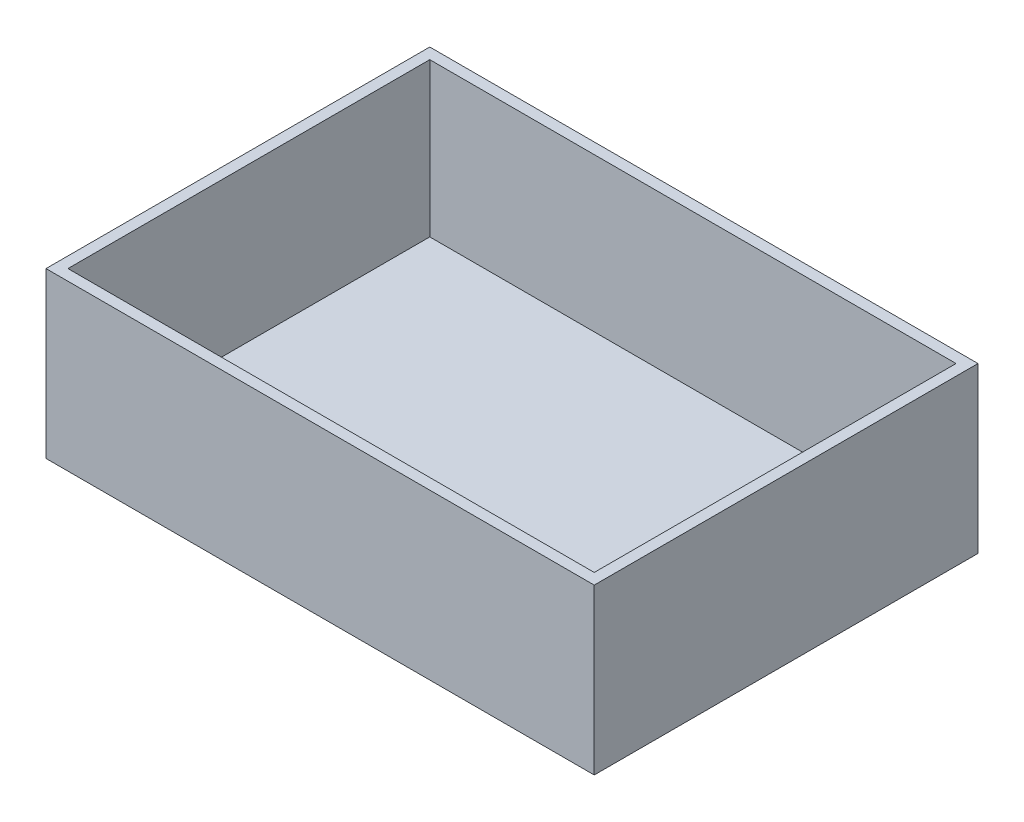
ISO-10303-21;
HEADER;
FILE_DESCRIPTION(('STEP AP214'),'2;1');
FILE_NAME('part.step','',(''),(''),'','','');
FILE_SCHEMA(('AUTOMOTIVE_DESIGN { 1 0 10303 214 1 1 1 1 }'));
ENDSEC;
DATA;
#1=APPLICATION_CONTEXT('core data for automotive mechanical design processes');
#2=APPLICATION_PROTOCOL_DEFINITION('international standard','automotive_design',2000,#1);
#3=PRODUCT_CONTEXT('',#1,'mechanical');
#4=PRODUCT('Part','Part','',(#3));
#5=PRODUCT_RELATED_PRODUCT_CATEGORY('part','',(#4));
#6=PRODUCT_DEFINITION_FORMATION('','',#4);
#7=PRODUCT_DEFINITION_CONTEXT('part definition',#1,'design');
#8=PRODUCT_DEFINITION('design','',#6,#7);
#9=PRODUCT_DEFINITION_SHAPE('','',#8);
#10=(LENGTH_UNIT() NAMED_UNIT(*) SI_UNIT(.MILLI.,.METRE.));
#11=(NAMED_UNIT(*) PLANE_ANGLE_UNIT() SI_UNIT($,.RADIAN.));
#12=(NAMED_UNIT(*) SI_UNIT($,.STERADIAN.) SOLID_ANGLE_UNIT());
#13=UNCERTAINTY_MEASURE_WITH_UNIT(LENGTH_MEASURE(1.E-05),#10,'distance_accuracy_value','');
#14=(GEOMETRIC_REPRESENTATION_CONTEXT(3) GLOBAL_UNCERTAINTY_ASSIGNED_CONTEXT((#13)) GLOBAL_UNIT_ASSIGNED_CONTEXT((#10,
#11,#12)) REPRESENTATION_CONTEXT('',''));
#15=CARTESIAN_POINT('',(0.,0.,0.));
#16=DIRECTION('',(0.,0.,1.));
#17=DIRECTION('',(1.,0.,0.));
#18=AXIS2_PLACEMENT_3D('',#15,#16,#17);
#19=CARTESIAN_POINT('',(-50.,30.,35.));
#20=DIRECTION('',(1.,0.,0.));
#21=DIRECTION('',(0.,0.,-1.));
#22=AXIS2_PLACEMENT_3D('',#19,#20,#21);
#23=PLANE('',#22);
#24=DIRECTION('',(0.,0.,1.));
#25=VECTOR('',#24,1.);
#26=CARTESIAN_POINT('',(-50.,0.,35.));
#27=LINE('',#26,#25);
#28=CARTESIAN_POINT('',(-50.,0.,-35.));
#29=VERTEX_POINT('',#28);
#30=CARTESIAN_POINT('',(-50.,0.,35.));
#31=VERTEX_POINT('',#30);
#32=EDGE_CURVE('E175',#29,#31,#27,.T.);
#33=ORIENTED_EDGE('',*,*,#32,.T.);
#34=DIRECTION('',(0.,-1.,0.));
#35=VECTOR('',#34,1.);
#36=CARTESIAN_POINT('',(-50.,30.,35.));
#37=LINE('',#36,#35);
#38=CARTESIAN_POINT('',(-50.,30.,35.));
#39=VERTEX_POINT('',#38);
#40=EDGE_CURVE('E11',#39,#31,#37,.T.);
#41=ORIENTED_EDGE('',*,*,#40,.F.);
#42=DIRECTION('',(0.,0.,1.));
#43=VECTOR('',#42,1.);
#44=CARTESIAN_POINT('',(-50.,30.,35.));
#45=LINE('',#44,#43);
#46=CARTESIAN_POINT('',(-50.,30.,-35.));
#47=VERTEX_POINT('',#46);
#48=EDGE_CURVE('E161',#47,#39,#45,.T.);
#49=ORIENTED_EDGE('',*,*,#48,.F.);
#50=DIRECTION('',(0.,-1.,0.));
#51=VECTOR('',#50,1.);
#52=CARTESIAN_POINT('',(-50.,30.,-35.));
#53=LINE('',#52,#51);
#54=EDGE_CURVE('E172',#47,#29,#53,.T.);
#55=ORIENTED_EDGE('',*,*,#54,.T.);
#56=EDGE_LOOP('',(#33,#41,#49,#55));
#57=FACE_BOUND('',#56,.T.);
#58=ADVANCED_FACE('F42',(#57),#23,.F.);
#59=CARTESIAN_POINT('',(50.,30.,35.));
#60=DIRECTION('',(0.,0.,-1.));
#61=DIRECTION('',(-1.,0.,0.));
#62=AXIS2_PLACEMENT_3D('',#59,#60,#61);
#63=PLANE('',#62);
#64=DIRECTION('',(1.,0.,0.));
#65=VECTOR('',#64,1.);
#66=CARTESIAN_POINT('',(50.,0.,35.));
#67=LINE('',#66,#65);
#68=CARTESIAN_POINT('',(50.,0.,35.));
#69=VERTEX_POINT('',#68);
#70=EDGE_CURVE('E176',#31,#69,#67,.T.);
#71=ORIENTED_EDGE('',*,*,#70,.T.);
#72=DIRECTION('',(0.,-1.,0.));
#73=VECTOR('',#72,1.);
#74=CARTESIAN_POINT('',(50.,30.,35.));
#75=LINE('',#74,#73);
#76=CARTESIAN_POINT('',(50.,30.,35.));
#77=VERTEX_POINT('',#76);
#78=EDGE_CURVE('E55',#77,#69,#75,.T.);
#79=ORIENTED_EDGE('',*,*,#78,.F.);
#80=DIRECTION('',(1.,0.,0.));
#81=VECTOR('',#80,1.);
#82=CARTESIAN_POINT('',(50.,30.,35.));
#83=LINE('',#82,#81);
#84=EDGE_CURVE('E96',#39,#77,#83,.T.);
#85=ORIENTED_EDGE('',*,*,#84,.F.);
#86=ORIENTED_EDGE('',*,*,#40,.T.);
#87=EDGE_LOOP('',(#71,#79,#85,#86));
#88=FACE_BOUND('',#87,.T.);
#89=ADVANCED_FACE('F215',(#88),#63,.F.);
#90=CARTESIAN_POINT('',(50.,30.,35.));
#91=DIRECTION('',(-1.,0.,0.));
#92=DIRECTION('',(0.,0.,1.));
#93=AXIS2_PLACEMENT_3D('',#90,#91,#92);
#94=PLANE('',#93);
#95=DIRECTION('',(0.,0.,-1.));
#96=VECTOR('',#95,1.);
#97=CARTESIAN_POINT('',(50.,0.,35.));
#98=LINE('',#97,#96);
#99=CARTESIAN_POINT('',(50.,0.,-35.));
#100=VERTEX_POINT('',#99);
#101=EDGE_CURVE('E178',#69,#100,#98,.T.);
#102=ORIENTED_EDGE('',*,*,#101,.T.);
#103=DIRECTION('',(0.,-1.,0.));
#104=VECTOR('',#103,1.);
#105=CARTESIAN_POINT('',(50.,30.,-35.));
#106=LINE('',#105,#104);
#107=CARTESIAN_POINT('',(50.,30.,-35.));
#108=VERTEX_POINT('',#107);
#109=EDGE_CURVE('E187',#108,#100,#106,.T.);
#110=ORIENTED_EDGE('',*,*,#109,.F.);
#111=DIRECTION('',(0.,0.,-1.));
#112=VECTOR('',#111,1.);
#113=CARTESIAN_POINT('',(50.,30.,35.));
#114=LINE('',#113,#112);
#115=EDGE_CURVE('E167',#77,#108,#114,.T.);
#116=ORIENTED_EDGE('',*,*,#115,.F.);
#117=ORIENTED_EDGE('',*,*,#78,.T.);
#118=EDGE_LOOP('',(#102,#110,#116,#117));
#119=FACE_BOUND('',#118,.T.);
#120=ADVANCED_FACE('F192',(#119),#94,.F.);
#121=CARTESIAN_POINT('',(50.,30.,-35.));
#122=DIRECTION('',(0.,0.,1.));
#123=DIRECTION('',(1.,0.,0.));
#124=AXIS2_PLACEMENT_3D('',#121,#122,#123);
#125=PLANE('',#124);
#126=DIRECTION('',(-1.,0.,0.));
#127=VECTOR('',#126,1.);
#128=CARTESIAN_POINT('',(50.,0.,-35.));
#129=LINE('',#128,#127);
#130=EDGE_CURVE('E90',#100,#29,#129,.T.);
#131=ORIENTED_EDGE('',*,*,#130,.T.);
#132=ORIENTED_EDGE('',*,*,#54,.F.);
#133=DIRECTION('',(-1.,0.,0.));
#134=VECTOR('',#133,1.);
#135=CARTESIAN_POINT('',(50.,30.,-35.));
#136=LINE('',#135,#134);
#137=EDGE_CURVE('E67',#108,#47,#136,.T.);
#138=ORIENTED_EDGE('',*,*,#137,.F.);
#139=ORIENTED_EDGE('',*,*,#109,.T.);
#140=EDGE_LOOP('',(#131,#132,#138,#139));
#141=FACE_BOUND('',#140,.T.);
#142=ADVANCED_FACE('F203',(#141),#125,.F.);
#143=CARTESIAN_POINT('',(0.,30.,0.));
#144=DIRECTION('',(0.,1.,0.));
#145=DIRECTION('',(0.,0.,1.));
#146=AXIS2_PLACEMENT_3D('',#143,#144,#145);
#147=PLANE('',#146);
#148=DIRECTION('',(0.,0.,1.));
#149=VECTOR('',#148,1.);
#150=CARTESIAN_POINT('',(-48.,30.,35.));
#151=LINE('',#150,#149);
#152=CARTESIAN_POINT('',(-48.,30.,-33.));
#153=VERTEX_POINT('',#152);
#154=CARTESIAN_POINT('',(-48.,30.,33.));
#155=VERTEX_POINT('',#154);
#156=EDGE_CURVE('E144',#153,#155,#151,.T.);
#157=ORIENTED_EDGE('',*,*,#156,.F.);
#158=DIRECTION('',(-1.,0.,0.));
#159=VECTOR('',#158,1.);
#160=CARTESIAN_POINT('',(50.,30.,-33.));
#161=LINE('',#160,#159);
#162=CARTESIAN_POINT('',(48.,30.,-33.));
#163=VERTEX_POINT('',#162);
#164=EDGE_CURVE('E158',#163,#153,#161,.T.);
#165=ORIENTED_EDGE('',*,*,#164,.F.);
#166=DIRECTION('',(0.,0.,-1.));
#167=VECTOR('',#166,1.);
#168=CARTESIAN_POINT('',(48.,30.,35.));
#169=LINE('',#168,#167);
#170=CARTESIAN_POINT('',(48.,30.,33.));
#171=VERTEX_POINT('',#170);
#172=EDGE_CURVE('E154',#171,#163,#169,.T.);
#173=ORIENTED_EDGE('',*,*,#172,.F.);
#174=DIRECTION('',(1.,0.,0.));
#175=VECTOR('',#174,1.);
#176=CARTESIAN_POINT('',(50.,30.,33.));
#177=LINE('',#176,#175);
#178=EDGE_CURVE('E131',#155,#171,#177,.T.);
#179=ORIENTED_EDGE('',*,*,#178,.F.);
#180=EDGE_LOOP('',(#157,#165,#173,#179));
#181=FACE_BOUND('',#180,.T.);
#182=ORIENTED_EDGE('',*,*,#48,.T.);
#183=ORIENTED_EDGE('',*,*,#84,.T.);
#184=ORIENTED_EDGE('',*,*,#115,.T.);
#185=ORIENTED_EDGE('',*,*,#137,.T.);
#186=EDGE_LOOP('',(#182,#183,#184,#185));
#187=FACE_BOUND('',#186,.T.);
#188=ADVANCED_FACE('F201',(#181,#187),#147,.T.);
#189=CARTESIAN_POINT('',(0.,0.,0.));
#190=DIRECTION('',(0.,1.,0.));
#191=DIRECTION('',(0.,0.,1.));
#192=AXIS2_PLACEMENT_3D('',#189,#190,#191);
#193=PLANE('',#192);
#194=ORIENTED_EDGE('',*,*,#32,.F.);
#195=ORIENTED_EDGE('',*,*,#130,.F.);
#196=ORIENTED_EDGE('',*,*,#101,.F.);
#197=ORIENTED_EDGE('',*,*,#70,.F.);
#198=EDGE_LOOP('',(#194,#195,#196,#197));
#199=FACE_BOUND('',#198,.T.);
#200=ADVANCED_FACE('F197',(#199),#193,.F.);
#201=CARTESIAN_POINT('',(-48.,30.,35.));
#202=DIRECTION('',(1.,0.,0.));
#203=DIRECTION('',(0.,0.,-1.));
#204=AXIS2_PLACEMENT_3D('',#201,#202,#203);
#205=PLANE('',#204);
#206=DIRECTION('',(0.,0.,1.));
#207=VECTOR('',#206,1.);
#208=CARTESIAN_POINT('',(-48.,2.,35.));
#209=LINE('',#208,#207);
#210=CARTESIAN_POINT('',(-48.,2.,-33.));
#211=VERTEX_POINT('',#210);
#212=CARTESIAN_POINT('',(-48.,2.,33.));
#213=VERTEX_POINT('',#212);
#214=EDGE_CURVE('E123',#211,#213,#209,.T.);
#215=ORIENTED_EDGE('',*,*,#214,.F.);
#216=DIRECTION('',(0.,-1.,0.));
#217=VECTOR('',#216,1.);
#218=CARTESIAN_POINT('',(-48.,30.,-33.));
#219=LINE('',#218,#217);
#220=EDGE_CURVE('E149',#153,#211,#219,.T.);
#221=ORIENTED_EDGE('',*,*,#220,.F.);
#222=ORIENTED_EDGE('',*,*,#156,.T.);
#223=DIRECTION('',(0.,-1.,0.));
#224=VECTOR('',#223,1.);
#225=CARTESIAN_POINT('',(-48.,30.,33.));
#226=LINE('',#225,#224);
#227=EDGE_CURVE('E137',#155,#213,#226,.T.);
#228=ORIENTED_EDGE('',*,*,#227,.T.);
#229=EDGE_LOOP('',(#215,#221,#222,#228));
#230=FACE_BOUND('',#229,.T.);
#231=ADVANCED_FACE('F246',(#230),#205,.T.);
#232=CARTESIAN_POINT('',(50.,30.,33.));
#233=DIRECTION('',(0.,0.,-1.));
#234=DIRECTION('',(-1.,0.,0.));
#235=AXIS2_PLACEMENT_3D('',#232,#233,#234);
#236=PLANE('',#235);
#237=DIRECTION('',(1.,0.,0.));
#238=VECTOR('',#237,1.);
#239=CARTESIAN_POINT('',(50.,2.,33.));
#240=LINE('',#239,#238);
#241=CARTESIAN_POINT('',(48.,2.,33.));
#242=VERTEX_POINT('',#241);
#243=EDGE_CURVE('E119',#213,#242,#240,.T.);
#244=ORIENTED_EDGE('',*,*,#243,.F.);
#245=ORIENTED_EDGE('',*,*,#227,.F.);
#246=ORIENTED_EDGE('',*,*,#178,.T.);
#247=DIRECTION('',(0.,-1.,0.));
#248=VECTOR('',#247,1.);
#249=CARTESIAN_POINT('',(48.,30.,33.));
#250=LINE('',#249,#248);
#251=EDGE_CURVE('E132',#171,#242,#250,.T.);
#252=ORIENTED_EDGE('',*,*,#251,.T.);
#253=EDGE_LOOP('',(#244,#245,#246,#252));
#254=FACE_BOUND('',#253,.T.);
#255=ADVANCED_FACE('F135',(#254),#236,.T.);
#256=CARTESIAN_POINT('',(48.,30.,35.));
#257=DIRECTION('',(-1.,0.,0.));
#258=DIRECTION('',(0.,0.,1.));
#259=AXIS2_PLACEMENT_3D('',#256,#257,#258);
#260=PLANE('',#259);
#261=DIRECTION('',(0.,0.,-1.));
#262=VECTOR('',#261,1.);
#263=CARTESIAN_POINT('',(48.,2.,35.));
#264=LINE('',#263,#262);
#265=CARTESIAN_POINT('',(48.,2.,-33.));
#266=VERTEX_POINT('',#265);
#267=EDGE_CURVE('E125',#242,#266,#264,.T.);
#268=ORIENTED_EDGE('',*,*,#267,.F.);
#269=ORIENTED_EDGE('',*,*,#251,.F.);
#270=ORIENTED_EDGE('',*,*,#172,.T.);
#271=DIRECTION('',(0.,-1.,0.));
#272=VECTOR('',#271,1.);
#273=CARTESIAN_POINT('',(48.,30.,-33.));
#274=LINE('',#273,#272);
#275=EDGE_CURVE('E56',#163,#266,#274,.T.);
#276=ORIENTED_EDGE('',*,*,#275,.T.);
#277=EDGE_LOOP('',(#268,#269,#270,#276));
#278=FACE_BOUND('',#277,.T.);
#279=ADVANCED_FACE('F139',(#278),#260,.T.);
#280=CARTESIAN_POINT('',(50.,30.,-33.));
#281=DIRECTION('',(0.,0.,1.));
#282=DIRECTION('',(1.,0.,0.));
#283=AXIS2_PLACEMENT_3D('',#280,#281,#282);
#284=PLANE('',#283);
#285=DIRECTION('',(-1.,0.,0.));
#286=VECTOR('',#285,1.);
#287=CARTESIAN_POINT('',(50.,2.,-33.));
#288=LINE('',#287,#286);
#289=EDGE_CURVE('E142',#266,#211,#288,.T.);
#290=ORIENTED_EDGE('',*,*,#289,.F.);
#291=ORIENTED_EDGE('',*,*,#275,.F.);
#292=ORIENTED_EDGE('',*,*,#164,.T.);
#293=ORIENTED_EDGE('',*,*,#220,.T.);
#294=EDGE_LOOP('',(#290,#291,#292,#293));
#295=FACE_BOUND('',#294,.T.);
#296=ADVANCED_FACE('F269',(#295),#284,.T.);
#297=CARTESIAN_POINT('',(0.,2.,0.));
#298=DIRECTION('',(0.,1.,0.));
#299=DIRECTION('',(0.,0.,1.));
#300=AXIS2_PLACEMENT_3D('',#297,#298,#299);
#301=PLANE('',#300);
#302=ORIENTED_EDGE('',*,*,#214,.T.);
#303=ORIENTED_EDGE('',*,*,#243,.T.);
#304=ORIENTED_EDGE('',*,*,#267,.T.);
#305=ORIENTED_EDGE('',*,*,#289,.T.);
#306=EDGE_LOOP('',(#302,#303,#304,#305));
#307=FACE_BOUND('',#306,.T.);
#308=ADVANCED_FACE('F118',(#307),#301,.T.);
#309=CLOSED_SHELL('',(#58,#89,#120,#142,#188,#200,#231,#255,#279,#296,#308));
#310=MANIFOLD_SOLID_BREP('B2',#309);
#311=ADVANCED_BREP_SHAPE_REPRESENTATION('',(#18,#310),#14);
#312=SHAPE_DEFINITION_REPRESENTATION(#9,#311);
ENDSEC;
END-ISO-10303-21;
